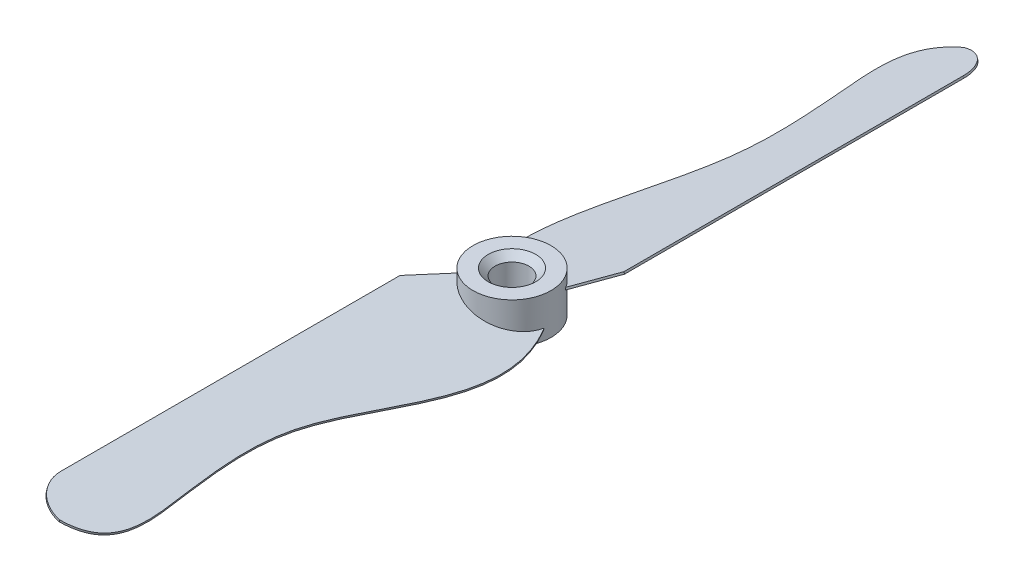
ISO-10303-21;
HEADER;
FILE_DESCRIPTION(('STEP AP214'),'2;1');
FILE_NAME('part.step','',(''),(''),'','','');
FILE_SCHEMA(('AUTOMOTIVE_DESIGN { 1 0 10303 214 1 1 1 1 }'));
ENDSEC;
DATA;
#1=APPLICATION_CONTEXT('core data for automotive mechanical design processes');
#2=APPLICATION_PROTOCOL_DEFINITION('international standard','automotive_design',2000,#1);
#3=PRODUCT_CONTEXT('',#1,'mechanical');
#4=PRODUCT('Part','Part','',(#3));
#5=PRODUCT_RELATED_PRODUCT_CATEGORY('part','',(#4));
#6=PRODUCT_DEFINITION_FORMATION('','',#4);
#7=PRODUCT_DEFINITION_CONTEXT('part definition',#1,'design');
#8=PRODUCT_DEFINITION('design','',#6,#7);
#9=PRODUCT_DEFINITION_SHAPE('','',#8);
#10=(LENGTH_UNIT() NAMED_UNIT(*) SI_UNIT(.MILLI.,.METRE.));
#11=(NAMED_UNIT(*) PLANE_ANGLE_UNIT() SI_UNIT($,.RADIAN.));
#12=(NAMED_UNIT(*) SI_UNIT($,.STERADIAN.) SOLID_ANGLE_UNIT());
#13=UNCERTAINTY_MEASURE_WITH_UNIT(LENGTH_MEASURE(1.E-05),#10,'distance_accuracy_value','');
#14=(GEOMETRIC_REPRESENTATION_CONTEXT(3) GLOBAL_UNCERTAINTY_ASSIGNED_CONTEXT((#13)) GLOBAL_UNIT_ASSIGNED_CONTEXT((#10,
#11,#12)) REPRESENTATION_CONTEXT('',''));
#15=CARTESIAN_POINT('',(0.,0.,0.));
#16=DIRECTION('',(0.,0.,1.));
#17=DIRECTION('',(1.,0.,0.));
#18=AXIS2_PLACEMENT_3D('',#15,#16,#17);
#19=CARTESIAN_POINT('',(0.,2.44862259020377,0.));
#20=DIRECTION('',(0.,-1.,0.));
#21=DIRECTION('',(0.,0.,-1.));
#22=AXIS2_PLACEMENT_3D('',#19,#20,#21);
#23=CYLINDRICAL_SURFACE('',#22,4.6);
#24=CARTESIAN_POINT('',(-4.52592427596631,-1.28832830619504,-0.822197937372003));
#25=CARTESIAN_POINT('',(-4.5285506971097,-1.24756050914766,-0.807744247647909));
#26=CARTESIAN_POINT('',(-4.53111321234596,-1.20680583719175,-0.793242829186531));
#27=CARTESIAN_POINT('',(-4.53611043100423,-1.12532274346283,-0.764144534789204));
#28=CARTESIAN_POINT('',(-4.53854513442625,-1.08459432168982,-0.749547658853257));
#29=CARTESIAN_POINT('',(-4.54091593194114,-1.04387902500828,-0.734903054180024));
#30=B_SPLINE_CURVE_WITH_KNOTS('',3,(#24,#25,#26,#27,#28,#29),.UNSPECIFIED.,.F.,.F.,(4,2,4),(0.,
0.13000080065777,0.260001601315541),.UNSPECIFIED.);
#31=CARTESIAN_POINT('',(-4.52592427596631,-1.28832830619504,-0.822197937372003));
#32=VERTEX_POINT('',#31);
#33=CARTESIAN_POINT('',(-4.54091593194114,-1.04387902500828,-0.734903054180025));
#34=VERTEX_POINT('',#33);
#35=EDGE_CURVE('E49',#32,#34,#30,.T.);
#36=ORIENTED_EDGE('',*,*,#35,.F.);
#37=CARTESIAN_POINT('',(0.,-0.0756105514454437,0.));
#38=DIRECTION('',(0.258819045102521,-0.965925826289068,0.));
#39=DIRECTION('',(-0.965925826289068,-0.258819045102521,0.));
#40=AXIS2_PLACEMENT_3D('',#37,#38,#39);
#41=ELLIPSE('',#40,4.76227042988638,4.6);
#42=CARTESIAN_POINT('',(3.93441720148487,0.978613360379548,-2.38335085219527));
#43=VERTEX_POINT('',#42);
#44=EDGE_CURVE('E53',#32,#43,#41,.T.);
#45=ORIENTED_EDGE('',*,*,#44,.T.);
#46=CARTESIAN_POINT('',(0.,10.1851570964716,0.));
#47=DIRECTION('',(-0.830186884635987,-0.222447905305123,-0.511181636997807));
#48=DIRECTION('',(0.189419314429536,-0.974944577617294,0.11663358819689));
#49=AXIS2_PLACEMENT_3D('',#46,#47,#48);
#50=ELLIPSE('',#49,20.6789989489465,4.6);
#51=CARTESIAN_POINT('',(3.90230344961384,1.21847478979819,-2.4355754529745));
#52=VERTEX_POINT('',#51);
#53=EDGE_CURVE('E205',#52,#43,#50,.T.);
#54=ORIENTED_EDGE('',*,*,#53,.F.);
#55=CARTESIAN_POINT('',(0.,0.172855731852976,0.));
#56=DIRECTION('',(0.258819045102521,-0.965925826289068,0.));
#57=DIRECTION('',(-0.965925826289068,-0.258819045102521,0.));
#58=AXIS2_PLACEMENT_3D('',#55,#56,#57);
#59=ELLIPSE('',#58,4.76227042988638,4.6);
#60=EDGE_CURVE('E278',#34,#52,#59,.T.);
#61=ORIENTED_EDGE('',*,*,#60,.F.);
#62=EDGE_LOOP('',(#36,#45,#54,#61));
#63=FACE_BOUND('',#62,.T.);
#64=CARTESIAN_POINT('',(4.52592427596631,-1.28832830619504,0.822197937372004));
#65=CARTESIAN_POINT('',(4.5285506971097,-1.24756050914766,0.807744247647911));
#66=CARTESIAN_POINT('',(4.53111321234596,-1.20680583719175,0.793242829186533));
#67=CARTESIAN_POINT('',(4.53611043100423,-1.12532274346283,0.764144534789206));
#68=CARTESIAN_POINT('',(4.53854513442625,-1.08459432168982,0.749547658853258));
#69=CARTESIAN_POINT('',(4.54091593194114,-1.04387902500828,0.734903054180025));
#70=B_SPLINE_CURVE_WITH_KNOTS('',3,(#64,#65,#66,#67,#68,#69),.UNSPECIFIED.,.F.,.F.,(4,2,4),(0.,
0.13000080065777,0.260001601315541),.UNSPECIFIED.);
#71=CARTESIAN_POINT('',(4.52592427596631,-1.28832830619504,0.822197937372004));
#72=VERTEX_POINT('',#71);
#73=CARTESIAN_POINT('',(4.54091593194114,-1.04387902500828,0.734903054180025));
#74=VERTEX_POINT('',#73);
#75=EDGE_CURVE('E180',#72,#74,#70,.T.);
#76=ORIENTED_EDGE('',*,*,#75,.F.);
#77=CARTESIAN_POINT('',(0.,-0.0756105514454437,0.));
#78=DIRECTION('',(-0.258819045102521,-0.965925826289068,0.));
#79=DIRECTION('',(0.965925826289068,-0.258819045102521,0.));
#80=AXIS2_PLACEMENT_3D('',#77,#78,#79);
#81=ELLIPSE('',#80,4.76227042988638,4.6);
#82=CARTESIAN_POINT('',(-3.93441720148487,0.978613360379548,2.38335085219527));
#83=VERTEX_POINT('',#82);
#84=EDGE_CURVE('E189',#72,#83,#81,.T.);
#85=ORIENTED_EDGE('',*,*,#84,.T.);
#86=CARTESIAN_POINT('',(0.,10.1851570964716,0.));
#87=DIRECTION('',(0.830186884635987,-0.222447905305123,0.511181636997807));
#88=DIRECTION('',(-0.189419314429536,-0.974944577617294,-0.11663358819689));
#89=AXIS2_PLACEMENT_3D('',#86,#87,#88);
#90=ELLIPSE('',#89,20.6789989489465,4.6);
#91=CARTESIAN_POINT('',(-3.90230344961384,1.21847478979819,2.4355754529745));
#92=VERTEX_POINT('',#91);
#93=EDGE_CURVE('E190',#92,#83,#90,.T.);
#94=ORIENTED_EDGE('',*,*,#93,.F.);
#95=CARTESIAN_POINT('',(0.,0.172855731852976,0.));
#96=DIRECTION('',(-0.258819045102521,-0.965925826289068,0.));
#97=DIRECTION('',(0.965925826289068,-0.258819045102521,0.));
#98=AXIS2_PLACEMENT_3D('',#95,#96,#97);
#99=ELLIPSE('',#98,4.76227042988638,4.6);
#100=EDGE_CURVE('E251',#74,#92,#99,.T.);
#101=ORIENTED_EDGE('',*,*,#100,.F.);
#102=EDGE_LOOP('',(#76,#85,#94,#101));
#103=FACE_BOUND('',#102,.T.);
#104=CARTESIAN_POINT('',(0.,2.44862259020377,0.));
#105=DIRECTION('',(0.,1.,0.));
#106=DIRECTION('',(0.,0.,1.));
#107=AXIS2_PLACEMENT_3D('',#104,#105,#106);
#108=CIRCLE('',#107,4.6);
#109=CARTESIAN_POINT('',(0.,2.44862259020377,4.6));
#110=VERTEX_POINT('',#109);
#111=EDGE_CURVE('E260',#110,#110,#108,.T.);
#112=ORIENTED_EDGE('',*,*,#111,.F.);
#113=EDGE_LOOP('',(#112));
#114=FACE_BOUND('',#113,.T.);
#115=CARTESIAN_POINT('',(0.,-2.35137740979623,0.));
#116=DIRECTION('',(0.,1.,0.));
#117=DIRECTION('',(0.,0.,1.));
#118=AXIS2_PLACEMENT_3D('',#115,#116,#117);
#119=CIRCLE('',#118,4.6);
#120=CARTESIAN_POINT('',(0.,-2.35137740979623,4.6));
#121=VERTEX_POINT('',#120);
#122=EDGE_CURVE('E259',#121,#121,#119,.T.);
#123=ORIENTED_EDGE('',*,*,#122,.T.);
#124=EDGE_LOOP('',(#123));
#125=FACE_BOUND('',#124,.T.);
#126=ADVANCED_FACE('F34',(#63,#103,#114,#125),#23,.T.);
#127=CARTESIAN_POINT('',(0.,2.44862259020377,0.));
#128=DIRECTION('',(0.,1.,0.));
#129=DIRECTION('',(0.,0.,1.));
#130=AXIS2_PLACEMENT_3D('',#127,#128,#129);
#131=PLANE('',#130);
#132=CARTESIAN_POINT('',(0.,2.44862259020377,0.));
#133=DIRECTION('',(0.,1.,0.));
#134=DIRECTION('',(0.,0.,1.));
#135=AXIS2_PLACEMENT_3D('',#132,#133,#134);
#136=CIRCLE('',#135,2.8);
#137=CARTESIAN_POINT('',(0.,2.44862259020377,2.8));
#138=VERTEX_POINT('',#137);
#139=EDGE_CURVE('E11',#138,#138,#136,.F.);
#140=ORIENTED_EDGE('',*,*,#139,.T.);
#141=EDGE_LOOP('',(#140));
#142=FACE_BOUND('',#141,.T.);
#143=ORIENTED_EDGE('',*,*,#111,.T.);
#144=EDGE_LOOP('',(#143));
#145=FACE_BOUND('',#144,.T.);
#146=ADVANCED_FACE('F177',(#142,#145),#131,.T.);
#147=CARTESIAN_POINT('',(0.,-2.35137740979623,0.));
#148=DIRECTION('',(0.,1.,0.));
#149=DIRECTION('',(0.,0.,1.));
#150=AXIS2_PLACEMENT_3D('',#147,#148,#149);
#151=PLANE('',#150);
#152=CARTESIAN_POINT('',(0.,-2.35137740979623,0.));
#153=DIRECTION('',(0.,1.,0.));
#154=DIRECTION('',(0.,0.,1.));
#155=AXIS2_PLACEMENT_3D('',#152,#153,#154);
#156=CIRCLE('',#155,2.8);
#157=CARTESIAN_POINT('',(0.,-2.35137740979623,2.8));
#158=VERTEX_POINT('',#157);
#159=EDGE_CURVE('E42',#158,#158,#156,.T.);
#160=ORIENTED_EDGE('',*,*,#159,.T.);
#161=EDGE_LOOP('',(#160));
#162=FACE_BOUND('',#161,.T.);
#163=ORIENTED_EDGE('',*,*,#122,.F.);
#164=EDGE_LOOP('',(#163));
#165=FACE_BOUND('',#164,.T.);
#166=ADVANCED_FACE('F174',(#162,#165),#151,.F.);
#167=CARTESIAN_POINT('',(4.40986847116733,-1.2572312470222,0.609597054870648));
#168=CARTESIAN_POINT('',(9.34333375254242,-2.57914928505364,9.48001505676606));
#169=CARTESIAN_POINT('',(-0.754484485865854,0.126552957244122,22.4672219731361));
#170=CARTESIAN_POINT('',(1.09859556073997,-0.369978344754137,39.6288465317599));
#171=CARTESIAN_POINT('',(2.21463012773884,-0.669018905706701,49.444775071292));
#172=CARTESIAN_POINT('',(-2.6080607172876,0.623217211563105,50.8));
#173=B_SPLINE_CURVE_WITH_KNOTS('',3,(#167,#168,#169,#170,#171,#172),.UNSPECIFIED.,.F.,.F.,(4,1,
1,4),(0.,0.512789375907892,0.775226186187926,1.),.UNSPECIFIED.);
#174=DIRECTION('',(0.258819045102521,0.965925826289068,0.));
#175=VECTOR('',#174,1.);
#176=SURFACE_OF_LINEAR_EXTRUSION('',#173,#175);
#177=CARTESIAN_POINT('',(-2.6080607172876,0.623217211563105,50.8));
#178=VERTEX_POINT('',#177);
#179=EDGE_CURVE('E156',#72,#178,#173,.T.);
#180=ORIENTED_EDGE('',*,*,#179,.F.);
#181=ORIENTED_EDGE('',*,*,#75,.T.);
#182=CARTESIAN_POINT('',(4.47198504199194,-1.02540904871283,0.609597054870648));
#183=CARTESIAN_POINT('',(9.40545032336703,-2.34732708674427,9.48001505676606));
#184=CARTESIAN_POINT('',(-0.692367915041248,0.358375155553499,22.4672219731361));
#185=CARTESIAN_POINT('',(1.16071213156458,-0.138156146444761,39.6288465317599));
#186=CARTESIAN_POINT('',(2.27674669856344,-0.437196707397325,49.444775071292));
#187=CARTESIAN_POINT('',(-2.545944146463,0.855039409872481,50.8));
#188=B_SPLINE_CURVE_WITH_KNOTS('',3,(#182,#183,#184,#185,#186,#187),.UNSPECIFIED.,.F.,.F.,(4,1,
1,4),(0.,0.512789375907892,0.775226186187926,1.),.UNSPECIFIED.);
#189=CARTESIAN_POINT('',(-2.545944146463,0.855039409872481,50.8));
#190=VERTEX_POINT('',#189);
#191=EDGE_CURVE('E125',#74,#190,#188,.T.);
#192=ORIENTED_EDGE('',*,*,#191,.T.);
#193=DIRECTION('',(0.258819045102521,0.965925826289068,0.));
#194=VECTOR('',#193,1.);
#195=CARTESIAN_POINT('',(-2.6080607172876,0.623217211563105,50.8));
#196=LINE('',#195,#194);
#197=EDGE_CURVE('E256',#178,#190,#196,.T.);
#198=ORIENTED_EDGE('',*,*,#197,.F.);
#199=EDGE_LOOP('',(#180,#181,#192,#198));
#200=FACE_BOUND('',#199,.T.);
#201=ADVANCED_FACE('F168',(#200),#176,.F.);
#202=CARTESIAN_POINT('',(-2.60806071728763,0.623217211563112,46.8));
#203=DIRECTION('',(0.258819045102521,0.965925826289068,0.));
#204=DIRECTION('',(-0.965925826289068,0.258819045102521,0.));
#205=AXIS2_PLACEMENT_3D('',#202,#203,#204);
#206=CYLINDRICAL_SURFACE('',#205,4.);
#207=CARTESIAN_POINT('',(-2.54594414646302,0.855039409872488,46.8));
#208=DIRECTION('',(-0.258819045102521,-0.965925826289068,0.));
#209=DIRECTION('',(-0.965925826289068,0.258819045102521,0.));
#210=AXIS2_PLACEMENT_3D('',#207,#208,#209);
#211=CIRCLE('',#210,4.);
#212=CARTESIAN_POINT('',(-6.4096474516193,1.89031559028257,46.8));
#213=VERTEX_POINT('',#212);
#214=EDGE_CURVE('E242',#190,#213,#211,.T.);
#215=ORIENTED_EDGE('',*,*,#214,.T.);
#216=DIRECTION('',(0.258819045102521,0.965925826289068,0.));
#217=VECTOR('',#216,1.);
#218=CARTESIAN_POINT('',(-6.4717640224439,1.6584933919732,46.8));
#219=LINE('',#218,#217);
#220=CARTESIAN_POINT('',(-6.4717640224439,1.6584933919732,46.8));
#221=VERTEX_POINT('',#220);
#222=EDGE_CURVE('E239',#221,#213,#219,.T.);
#223=ORIENTED_EDGE('',*,*,#222,.F.);
#224=CARTESIAN_POINT('',(-2.60806071728763,0.623217211563112,46.8));
#225=DIRECTION('',(-0.258819045102521,-0.965925826289068,0.));
#226=DIRECTION('',(-0.965925826289068,0.258819045102521,0.));
#227=AXIS2_PLACEMENT_3D('',#224,#225,#226);
#228=CIRCLE('',#227,4.);
#229=EDGE_CURVE('E161',#178,#221,#228,.T.);
#230=ORIENTED_EDGE('',*,*,#229,.F.);
#231=ORIENTED_EDGE('',*,*,#197,.T.);
#232=EDGE_LOOP('',(#215,#223,#230,#231));
#233=FACE_BOUND('',#232,.T.);
#234=ADVANCED_FACE('F173',(#233),#206,.T.);
#235=CARTESIAN_POINT('',(-6.4717640224439,1.6584933919732,6.8));
#236=DIRECTION('',(0.965925826289068,-0.258819045102521,0.));
#237=DIRECTION('',(0.258819045102521,0.965925826289068,0.));
#238=AXIS2_PLACEMENT_3D('',#235,#236,#237);
#239=PLANE('',#238);
#240=DIRECTION('',(0.,0.,-1.));
#241=VECTOR('',#240,1.);
#242=CARTESIAN_POINT('',(-6.4096474516193,1.89031559028257,6.8));
#243=LINE('',#242,#241);
#244=CARTESIAN_POINT('',(-6.4096474516193,1.89031559028257,6.8));
#245=VERTEX_POINT('',#244);
#246=EDGE_CURVE('E233',#213,#245,#243,.T.);
#247=ORIENTED_EDGE('',*,*,#246,.T.);
#248=DIRECTION('',(0.258819045102521,0.965925826289068,0.));
#249=VECTOR('',#248,1.);
#250=CARTESIAN_POINT('',(-6.4717640224439,1.6584933919732,6.8));
#251=LINE('',#250,#249);
#252=CARTESIAN_POINT('',(-6.4717640224439,1.6584933919732,6.8));
#253=VERTEX_POINT('',#252);
#254=EDGE_CURVE('E236',#253,#245,#251,.T.);
#255=ORIENTED_EDGE('',*,*,#254,.F.);
#256=DIRECTION('',(0.,0.,-1.));
#257=VECTOR('',#256,1.);
#258=CARTESIAN_POINT('',(-6.4717640224439,1.6584933919732,6.8));
#259=LINE('',#258,#257);
#260=EDGE_CURVE('E267',#221,#253,#259,.T.);
#261=ORIENTED_EDGE('',*,*,#260,.F.);
#262=ORIENTED_EDGE('',*,*,#222,.T.);
#263=EDGE_LOOP('',(#247,#255,#261,#262));
#264=FACE_BOUND('',#263,.T.);
#265=ADVANCED_FACE('F222',(#264),#239,.F.);
#266=CARTESIAN_POINT('',(-3.77105673668075,0.93484105576011,2.09899640301146));
#267=DIRECTION('',(0.830186884635987,-0.222447905305123,0.511181636997807));
#268=DIRECTION('',(0.524318662551162,0.,-0.851522131304032));
#269=AXIS2_PLACEMENT_3D('',#266,#267,#268);
#270=PLANE('',#269);
#271=DIRECTION('',(0.493763545100905,-0.132303543161716,-0.859472706952491));
#272=VECTOR('',#271,1.);
#273=CARTESIAN_POINT('',(-3.70894016585615,1.16666325406949,2.09899640301146));
#274=LINE('',#273,#272);
#275=EDGE_CURVE('E162',#245,#92,#274,.T.);
#276=ORIENTED_EDGE('',*,*,#275,.T.);
#277=ORIENTED_EDGE('',*,*,#93,.T.);
#278=DIRECTION('',(0.493763545100905,-0.132303543161716,-0.859472706952491));
#279=VECTOR('',#278,1.);
#280=CARTESIAN_POINT('',(-3.77105673668075,0.93484105576011,2.09899640301146));
#281=LINE('',#280,#279);
#282=EDGE_CURVE('E247',#253,#83,#281,.T.);
#283=ORIENTED_EDGE('',*,*,#282,.F.);
#284=ORIENTED_EDGE('',*,*,#254,.T.);
#285=EDGE_LOOP('',(#276,#277,#283,#284));
#286=FACE_BOUND('',#285,.T.);
#287=ADVANCED_FACE('F216',(#286),#270,.F.);
#288=CARTESIAN_POINT('',(0.683114337756975,-0.258650486585547,4.39694961287737));
#289=DIRECTION('',(-0.258819045102521,-0.965925826289068,0.));
#290=DIRECTION('',(0.965925826289068,-0.258819045102521,0.));
#291=AXIS2_PLACEMENT_3D('',#288,#289,#290);
#292=PLANE('',#291);
#293=ORIENTED_EDGE('',*,*,#84,.F.);
#294=ORIENTED_EDGE('',*,*,#179,.T.);
#295=ORIENTED_EDGE('',*,*,#229,.T.);
#296=ORIENTED_EDGE('',*,*,#260,.T.);
#297=ORIENTED_EDGE('',*,*,#282,.T.);
#298=EDGE_LOOP('',(#293,#294,#295,#296,#297));
#299=FACE_BOUND('',#298,.T.);
#300=ADVANCED_FACE('F213',(#299),#292,.T.);
#301=CARTESIAN_POINT('',(0.74523090858158,-0.0268282882761711,4.39694961287737));
#302=DIRECTION('',(-0.258819045102521,-0.965925826289068,0.));
#303=DIRECTION('',(0.965925826289068,-0.258819045102521,0.));
#304=AXIS2_PLACEMENT_3D('',#301,#302,#303);
#305=PLANE('',#304);
#306=ORIENTED_EDGE('',*,*,#191,.F.);
#307=ORIENTED_EDGE('',*,*,#100,.T.);
#308=ORIENTED_EDGE('',*,*,#275,.F.);
#309=ORIENTED_EDGE('',*,*,#246,.F.);
#310=ORIENTED_EDGE('',*,*,#214,.F.);
#311=EDGE_LOOP('',(#306,#307,#308,#309,#310));
#312=FACE_BOUND('',#311,.T.);
#313=ADVANCED_FACE('F211',(#312),#305,.F.);
#314=CARTESIAN_POINT('',(-4.40986847116733,-1.2572312470222,-0.609597054870647));
#315=CARTESIAN_POINT('',(-9.34333375254242,-2.57914928505364,-9.48001505676606));
#316=CARTESIAN_POINT('',(0.754484485865854,0.126552957244122,-22.4672219731361));
#317=CARTESIAN_POINT('',(-1.09859556073997,-0.369978344754137,-39.6288465317599));
#318=CARTESIAN_POINT('',(-2.21463012773884,-0.669018905706701,-49.444775071292));
#319=CARTESIAN_POINT('',(2.6080607172876,0.623217211563105,-50.8));
#320=B_SPLINE_CURVE_WITH_KNOTS('',3,(#314,#315,#316,#317,#318,#319),.UNSPECIFIED.,.F.,.F.,(4,1,
1,4),(0.,0.512789375907892,0.775226186187926,1.),.UNSPECIFIED.);
#321=DIRECTION('',(-0.258819045102521,0.965925826289068,0.));
#322=VECTOR('',#321,1.);
#323=SURFACE_OF_LINEAR_EXTRUSION('',#320,#322);
#324=CARTESIAN_POINT('',(2.6080607172876,0.623217211563105,-50.8));
#325=VERTEX_POINT('',#324);
#326=EDGE_CURVE('E108',#32,#325,#320,.T.);
#327=ORIENTED_EDGE('',*,*,#326,.F.);
#328=ORIENTED_EDGE('',*,*,#35,.T.);
#329=CARTESIAN_POINT('',(-4.47198504199194,-1.02540904871283,-0.609597054870647));
#330=CARTESIAN_POINT('',(-9.40545032336703,-2.34732708674427,-9.48001505676606));
#331=CARTESIAN_POINT('',(0.692367915041248,0.358375155553499,-22.4672219731361));
#332=CARTESIAN_POINT('',(-1.16071213156458,-0.138156146444761,-39.6288465317599));
#333=CARTESIAN_POINT('',(-2.27674669856344,-0.437196707397325,-49.444775071292));
#334=CARTESIAN_POINT('',(2.545944146463,0.855039409872481,-50.8));
#335=B_SPLINE_CURVE_WITH_KNOTS('',3,(#329,#330,#331,#332,#333,#334),.UNSPECIFIED.,.F.,.F.,(4,1,
1,4),(0.,0.512789375907892,0.775226186187926,1.),.UNSPECIFIED.);
#336=CARTESIAN_POINT('',(2.545944146463,0.855039409872481,-50.8));
#337=VERTEX_POINT('',#336);
#338=EDGE_CURVE('E122',#34,#337,#335,.T.);
#339=ORIENTED_EDGE('',*,*,#338,.T.);
#340=DIRECTION('',(-0.258819045102521,0.965925826289068,0.));
#341=VECTOR('',#340,1.);
#342=CARTESIAN_POINT('',(2.6080607172876,0.623217211563105,-50.8));
#343=LINE('',#342,#341);
#344=EDGE_CURVE('E119',#325,#337,#343,.T.);
#345=ORIENTED_EDGE('',*,*,#344,.F.);
#346=EDGE_LOOP('',(#327,#328,#339,#345));
#347=FACE_BOUND('',#346,.T.);
#348=ADVANCED_FACE('F120',(#347),#323,.F.);
#349=CARTESIAN_POINT('',(2.60806071728763,0.623217211563112,-46.8));
#350=DIRECTION('',(-0.258819045102521,0.965925826289068,0.));
#351=DIRECTION('',(-0.965925826289068,-0.258819045102521,0.));
#352=AXIS2_PLACEMENT_3D('',#349,#350,#351);
#353=CYLINDRICAL_SURFACE('',#352,4.);
#354=CARTESIAN_POINT('',(2.54594414646302,0.855039409872488,-46.8));
#355=DIRECTION('',(0.258819045102521,-0.965925826289068,0.));
#356=DIRECTION('',(0.965925826289068,0.258819045102521,0.));
#357=AXIS2_PLACEMENT_3D('',#354,#355,#356);
#358=CIRCLE('',#357,4.);
#359=CARTESIAN_POINT('',(6.4096474516193,1.89031559028257,-46.8));
#360=VERTEX_POINT('',#359);
#361=EDGE_CURVE('E144',#337,#360,#358,.T.);
#362=ORIENTED_EDGE('',*,*,#361,.T.);
#363=DIRECTION('',(-0.258819045102521,0.965925826289068,0.));
#364=VECTOR('',#363,1.);
#365=CARTESIAN_POINT('',(6.4717640224439,1.6584933919732,-46.8));
#366=LINE('',#365,#364);
#367=CARTESIAN_POINT('',(6.4717640224439,1.6584933919732,-46.8));
#368=VERTEX_POINT('',#367);
#369=EDGE_CURVE('E126',#368,#360,#366,.T.);
#370=ORIENTED_EDGE('',*,*,#369,.F.);
#371=CARTESIAN_POINT('',(2.60806071728763,0.623217211563112,-46.8));
#372=DIRECTION('',(0.258819045102521,-0.965925826289068,0.));
#373=DIRECTION('',(0.965925826289068,0.258819045102521,0.));
#374=AXIS2_PLACEMENT_3D('',#371,#372,#373);
#375=CIRCLE('',#374,4.);
#376=EDGE_CURVE('E112',#325,#368,#375,.T.);
#377=ORIENTED_EDGE('',*,*,#376,.F.);
#378=ORIENTED_EDGE('',*,*,#344,.T.);
#379=EDGE_LOOP('',(#362,#370,#377,#378));
#380=FACE_BOUND('',#379,.T.);
#381=ADVANCED_FACE('F128',(#380),#353,.T.);
#382=CARTESIAN_POINT('',(6.4717640224439,1.6584933919732,-6.8));
#383=DIRECTION('',(-0.965925826289068,-0.258819045102521,0.));
#384=DIRECTION('',(0.258819045102521,-0.965925826289068,0.));
#385=AXIS2_PLACEMENT_3D('',#382,#383,#384);
#386=PLANE('',#385);
#387=DIRECTION('',(0.,0.,1.));
#388=VECTOR('',#387,1.);
#389=CARTESIAN_POINT('',(6.4096474516193,1.89031559028257,-6.8));
#390=LINE('',#389,#388);
#391=CARTESIAN_POINT('',(6.4096474516193,1.89031559028257,-6.8));
#392=VERTEX_POINT('',#391);
#393=EDGE_CURVE('E149',#360,#392,#390,.T.);
#394=ORIENTED_EDGE('',*,*,#393,.T.);
#395=DIRECTION('',(-0.258819045102521,0.965925826289068,0.));
#396=VECTOR('',#395,1.);
#397=CARTESIAN_POINT('',(6.4717640224439,1.6584933919732,-6.8));
#398=LINE('',#397,#396);
#399=CARTESIAN_POINT('',(6.4717640224439,1.6584933919732,-6.8));
#400=VERTEX_POINT('',#399);
#401=EDGE_CURVE('E140',#400,#392,#398,.T.);
#402=ORIENTED_EDGE('',*,*,#401,.F.);
#403=DIRECTION('',(0.,0.,1.));
#404=VECTOR('',#403,1.);
#405=CARTESIAN_POINT('',(6.4717640224439,1.6584933919732,-6.8));
#406=LINE('',#405,#404);
#407=EDGE_CURVE('E131',#368,#400,#406,.T.);
#408=ORIENTED_EDGE('',*,*,#407,.F.);
#409=ORIENTED_EDGE('',*,*,#369,.T.);
#410=EDGE_LOOP('',(#394,#402,#408,#409));
#411=FACE_BOUND('',#410,.T.);
#412=ADVANCED_FACE('F287',(#411),#386,.F.);
#413=CARTESIAN_POINT('',(3.77105673668075,0.93484105576011,-2.09899640301145));
#414=DIRECTION('',(-0.830186884635987,-0.222447905305123,-0.511181636997807));
#415=DIRECTION('',(-0.524318662551162,0.,0.851522131304032));
#416=AXIS2_PLACEMENT_3D('',#413,#414,#415);
#417=PLANE('',#416);
#418=DIRECTION('',(-0.493763545100905,-0.132303543161716,0.859472706952491));
#419=VECTOR('',#418,1.);
#420=CARTESIAN_POINT('',(3.70894016585615,1.16666325406949,-2.09899640301145));
#421=LINE('',#420,#419);
#422=EDGE_CURVE('E116',#392,#52,#421,.T.);
#423=ORIENTED_EDGE('',*,*,#422,.T.);
#424=ORIENTED_EDGE('',*,*,#53,.T.);
#425=DIRECTION('',(-0.493763545100905,-0.132303543161716,0.859472706952491));
#426=VECTOR('',#425,1.);
#427=CARTESIAN_POINT('',(3.77105673668075,0.93484105576011,-2.09899640301145));
#428=LINE('',#427,#426);
#429=EDGE_CURVE('E133',#400,#43,#428,.T.);
#430=ORIENTED_EDGE('',*,*,#429,.F.);
#431=ORIENTED_EDGE('',*,*,#401,.T.);
#432=EDGE_LOOP('',(#423,#424,#430,#431));
#433=FACE_BOUND('',#432,.T.);
#434=ADVANCED_FACE('F284',(#433),#417,.F.);
#435=CARTESIAN_POINT('',(-0.683114337756975,-0.258650486585547,-4.39694961287737));
#436=DIRECTION('',(0.258819045102521,-0.965925826289068,0.));
#437=DIRECTION('',(-0.965925826289068,-0.258819045102521,0.));
#438=AXIS2_PLACEMENT_3D('',#435,#436,#437);
#439=PLANE('',#438);
#440=ORIENTED_EDGE('',*,*,#44,.F.);
#441=ORIENTED_EDGE('',*,*,#326,.T.);
#442=ORIENTED_EDGE('',*,*,#376,.T.);
#443=ORIENTED_EDGE('',*,*,#407,.T.);
#444=ORIENTED_EDGE('',*,*,#429,.T.);
#445=EDGE_LOOP('',(#440,#441,#442,#443,#444));
#446=FACE_BOUND('',#445,.T.);
#447=ADVANCED_FACE('F110',(#446),#439,.T.);
#448=CARTESIAN_POINT('',(-0.74523090858158,-0.0268282882761711,-4.39694961287737));
#449=DIRECTION('',(0.258819045102521,-0.965925826289068,0.));
#450=DIRECTION('',(-0.965925826289068,-0.258819045102521,0.));
#451=AXIS2_PLACEMENT_3D('',#448,#449,#450);
#452=PLANE('',#451);
#453=ORIENTED_EDGE('',*,*,#338,.F.);
#454=ORIENTED_EDGE('',*,*,#60,.T.);
#455=ORIENTED_EDGE('',*,*,#422,.F.);
#456=ORIENTED_EDGE('',*,*,#393,.F.);
#457=ORIENTED_EDGE('',*,*,#361,.F.);
#458=EDGE_LOOP('',(#453,#454,#455,#456,#457));
#459=FACE_BOUND('',#458,.T.);
#460=ADVANCED_FACE('F289',(#459),#452,.F.);
#461=CARTESIAN_POINT('',(0.,2.44862259020377,0.));
#462=DIRECTION('',(0.,-1.,0.));
#463=DIRECTION('',(0.,0.,-1.));
#464=AXIS2_PLACEMENT_3D('',#461,#462,#463);
#465=CYLINDRICAL_SURFACE('',#464,2.);
#466=CARTESIAN_POINT('',(0.,-1.55137740979625,0.));
#467=DIRECTION('',(0.,1.,0.));
#468=DIRECTION('',(0.,0.,1.));
#469=AXIS2_PLACEMENT_3D('',#466,#467,#468);
#470=CIRCLE('',#469,2.);
#471=CARTESIAN_POINT('',(0.,-1.55137740979625,2.));
#472=VERTEX_POINT('',#471);
#473=EDGE_CURVE('E383',#472,#472,#470,.F.);
#474=ORIENTED_EDGE('',*,*,#473,.T.);
#475=EDGE_LOOP('',(#474));
#476=FACE_BOUND('',#475,.T.);
#477=CARTESIAN_POINT('',(0.,1.64862259020376,0.));
#478=DIRECTION('',(0.,1.,0.));
#479=DIRECTION('',(0.,0.,1.));
#480=AXIS2_PLACEMENT_3D('',#477,#478,#479);
#481=CIRCLE('',#480,2.);
#482=CARTESIAN_POINT('',(0.,1.64862259020376,2.));
#483=VERTEX_POINT('',#482);
#484=EDGE_CURVE('E381',#483,#483,#481,.T.);
#485=ORIENTED_EDGE('',*,*,#484,.T.);
#486=EDGE_LOOP('',(#485));
#487=FACE_BOUND('',#486,.T.);
#488=ADVANCED_FACE('F291',(#476,#487),#465,.F.);
#489=CARTESIAN_POINT('',(0.,-1.55137740979625,0.));
#490=DIRECTION('',(0.,-1.,0.));
#491=DIRECTION('',(0.,0.,-1.));
#492=AXIS2_PLACEMENT_3D('',#489,#490,#491);
#493=CONICAL_SURFACE('',#492,2.,0.785398163397458);
#494=ORIENTED_EDGE('',*,*,#159,.F.);
#495=EDGE_LOOP('',(#494));
#496=FACE_BOUND('',#495,.T.);
#497=ORIENTED_EDGE('',*,*,#473,.F.);
#498=EDGE_LOOP('',(#497));
#499=FACE_BOUND('',#498,.T.);
#500=ADVANCED_FACE('F195',(#496,#499),#493,.F.);
#501=CARTESIAN_POINT('',(0.,2.44862259020377,0.));
#502=DIRECTION('',(0.,1.,0.));
#503=DIRECTION('',(0.,0.,1.));
#504=AXIS2_PLACEMENT_3D('',#501,#502,#503);
#505=CONICAL_SURFACE('',#504,2.8,0.785398163397446);
#506=ORIENTED_EDGE('',*,*,#484,.F.);
#507=EDGE_LOOP('',(#506));
#508=FACE_BOUND('',#507,.T.);
#509=ORIENTED_EDGE('',*,*,#139,.F.);
#510=EDGE_LOOP('',(#509));
#511=FACE_BOUND('',#510,.T.);
#512=ADVANCED_FACE('F36',(#508,#511),#505,.F.);
#513=CLOSED_SHELL('',(#126,#146,#166,#201,#234,#265,#287,#300,#313,#348,#381,#412,#434,#447,
#460,#488,#500,#512));
#514=MANIFOLD_SOLID_BREP('B2',#513);
#515=ADVANCED_BREP_SHAPE_REPRESENTATION('',(#18,#514),#14);
#516=SHAPE_DEFINITION_REPRESENTATION(#9,#515);
ENDSEC;
END-ISO-10303-21;
